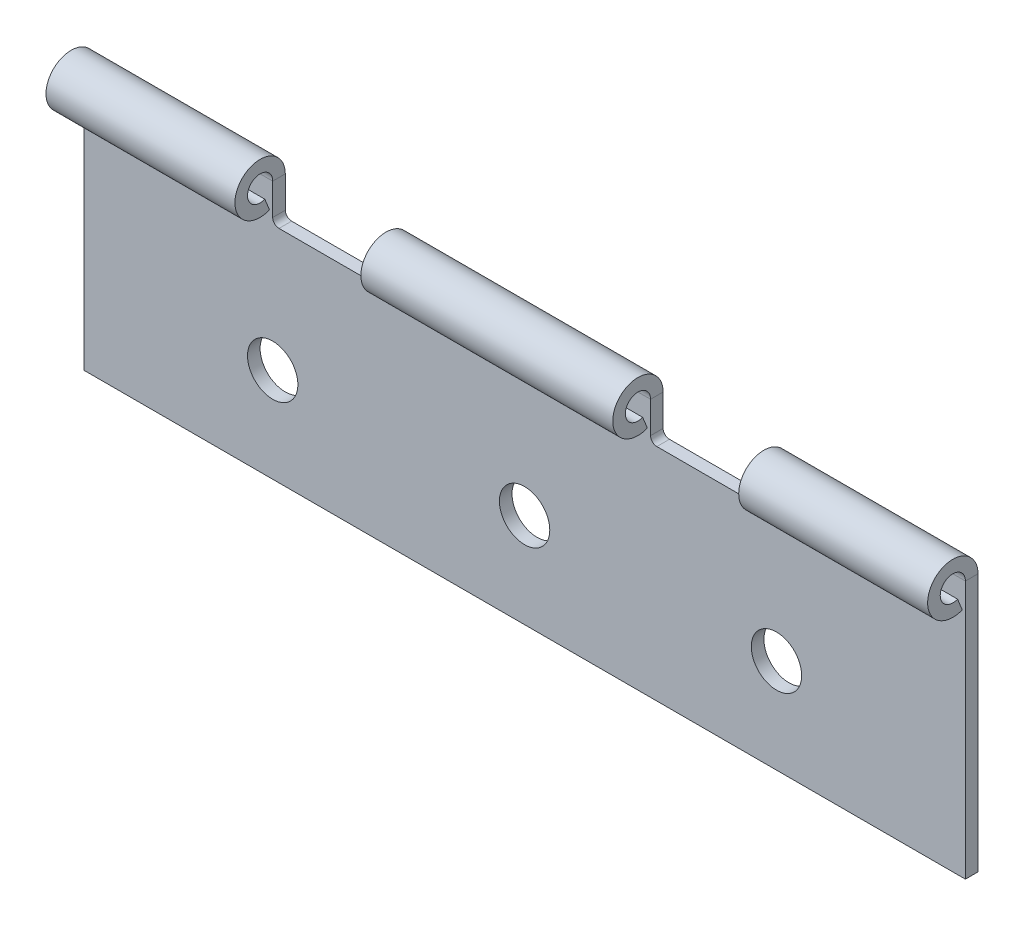
ISO-10303-21;
HEADER;
FILE_DESCRIPTION(('STEP AP214'),'2;1');
FILE_NAME('part.step','',(''),(''),'','','');
FILE_SCHEMA(('AUTOMOTIVE_DESIGN { 1 0 10303 214 1 1 1 1 }'));
ENDSEC;
DATA;
#1=APPLICATION_CONTEXT('core data for automotive mechanical design processes');
#2=APPLICATION_PROTOCOL_DEFINITION('international standard','automotive_design',2000,#1);
#3=PRODUCT_CONTEXT('',#1,'mechanical');
#4=PRODUCT('Part','Part','',(#3));
#5=PRODUCT_RELATED_PRODUCT_CATEGORY('part','',(#4));
#6=PRODUCT_DEFINITION_FORMATION('','',#4);
#7=PRODUCT_DEFINITION_CONTEXT('part definition',#1,'design');
#8=PRODUCT_DEFINITION('design','',#6,#7);
#9=PRODUCT_DEFINITION_SHAPE('','',#8);
#10=(LENGTH_UNIT() NAMED_UNIT(*) SI_UNIT(.MILLI.,.METRE.));
#11=(NAMED_UNIT(*) PLANE_ANGLE_UNIT() SI_UNIT($,.RADIAN.));
#12=(NAMED_UNIT(*) SI_UNIT($,.STERADIAN.) SOLID_ANGLE_UNIT());
#13=UNCERTAINTY_MEASURE_WITH_UNIT(LENGTH_MEASURE(1.E-05),#10,'distance_accuracy_value','');
#14=(GEOMETRIC_REPRESENTATION_CONTEXT(3) GLOBAL_UNCERTAINTY_ASSIGNED_CONTEXT((#13)) GLOBAL_UNIT_ASSIGNED_CONTEXT((#10,
#11,#12)) REPRESENTATION_CONTEXT('',''));
#15=CARTESIAN_POINT('',(0.,0.,0.));
#16=DIRECTION('',(0.,0.,1.));
#17=DIRECTION('',(1.,0.,0.));
#18=AXIS2_PLACEMENT_3D('',#15,#16,#17);
#19=CARTESIAN_POINT('',(110.,40.,-2.));
#20=DIRECTION('',(-1.,0.,0.));
#21=DIRECTION('',(0.,0.,1.));
#22=AXIS2_PLACEMENT_3D('',#19,#20,#21);
#23=PLANE('',#22);
#24=DIRECTION('',(0.,-1.,0.));
#25=VECTOR('',#24,1.);
#26=CARTESIAN_POINT('',(110.,40.,-2.));
#27=LINE('',#26,#25);
#28=CARTESIAN_POINT('',(110.,46.,-2.00000000000001));
#29=VERTEX_POINT('',#28);
#30=CARTESIAN_POINT('',(110.,41.,-2.));
#31=VERTEX_POINT('',#30);
#32=EDGE_CURVE('E209',#29,#31,#27,.T.);
#33=ORIENTED_EDGE('',*,*,#32,.T.);
#34=DIRECTION('',(0.,0.,1.));
#35=VECTOR('',#34,1.);
#36=CARTESIAN_POINT('',(110.,41.,0.));
#37=LINE('',#36,#35);
#38=CARTESIAN_POINT('',(110.,41.,0.));
#39=VERTEX_POINT('',#38);
#40=EDGE_CURVE('E236',#31,#39,#37,.T.);
#41=ORIENTED_EDGE('',*,*,#40,.T.);
#42=DIRECTION('',(0.,-1.,0.));
#43=VECTOR('',#42,1.);
#44=CARTESIAN_POINT('',(110.,40.,0.));
#45=LINE('',#44,#43);
#46=CARTESIAN_POINT('',(110.,46.,0.));
#47=VERTEX_POINT('',#46);
#48=EDGE_CURVE('E238',#47,#39,#45,.T.);
#49=ORIENTED_EDGE('',*,*,#48,.F.);
#50=DIRECTION('',(0.,0.,-1.));
#51=VECTOR('',#50,1.);
#52=CARTESIAN_POINT('',(110.,46.,0.));
#53=LINE('',#52,#51);
#54=EDGE_CURVE('E441',#47,#29,#53,.T.);
#55=ORIENTED_EDGE('',*,*,#54,.T.);
#56=EDGE_LOOP('',(#33,#41,#49,#55));
#57=FACE_BOUND('',#56,.T.);
#58=ADVANCED_FACE('F40',(#57),#23,.T.);
#59=CARTESIAN_POINT('',(50.,40.,-2.));
#60=DIRECTION('',(-1.,0.,0.));
#61=DIRECTION('',(0.,-1.,0.));
#62=AXIS2_PLACEMENT_3D('',#59,#60,#61);
#63=PLANE('',#62);
#64=DIRECTION('',(0.,-1.,0.));
#65=VECTOR('',#64,1.);
#66=CARTESIAN_POINT('',(50.,40.,-2.));
#67=LINE('',#66,#65);
#68=CARTESIAN_POINT('',(50.,46.,-2.));
#69=VERTEX_POINT('',#68);
#70=CARTESIAN_POINT('',(50.,41.,-2.));
#71=VERTEX_POINT('',#70);
#72=EDGE_CURVE('E226',#69,#71,#67,.T.);
#73=ORIENTED_EDGE('',*,*,#72,.T.);
#74=DIRECTION('',(0.,0.,1.));
#75=VECTOR('',#74,1.);
#76=CARTESIAN_POINT('',(50.,41.,0.));
#77=LINE('',#76,#75);
#78=CARTESIAN_POINT('',(50.,41.,0.));
#79=VERTEX_POINT('',#78);
#80=EDGE_CURVE('E263',#71,#79,#77,.T.);
#81=ORIENTED_EDGE('',*,*,#80,.T.);
#82=DIRECTION('',(0.,-1.,0.));
#83=VECTOR('',#82,1.);
#84=CARTESIAN_POINT('',(50.,40.,0.));
#85=LINE('',#84,#83);
#86=CARTESIAN_POINT('',(50.,46.,0.));
#87=VERTEX_POINT('',#86);
#88=EDGE_CURVE('E247',#87,#79,#85,.T.);
#89=ORIENTED_EDGE('',*,*,#88,.F.);
#90=DIRECTION('',(0.,0.,-1.));
#91=VECTOR('',#90,1.);
#92=CARTESIAN_POINT('',(50.,46.,0.));
#93=LINE('',#92,#91);
#94=EDGE_CURVE('E355',#87,#69,#93,.T.);
#95=ORIENTED_EDGE('',*,*,#94,.T.);
#96=EDGE_LOOP('',(#73,#81,#89,#95));
#97=FACE_BOUND('',#96,.T.);
#98=ADVANCED_FACE('F364',(#97),#63,.T.);
#99=CARTESIAN_POINT('',(0.,0.,-2.));
#100=DIRECTION('',(-1.,0.,0.));
#101=DIRECTION('',(0.,0.,1.));
#102=AXIS2_PLACEMENT_3D('',#99,#100,#101);
#103=PLANE('',#102);
#104=DIRECTION('',(0.,-1.,0.));
#105=VECTOR('',#104,1.);
#106=CARTESIAN_POINT('',(0.,0.,-2.));
#107=LINE('',#106,#105);
#108=CARTESIAN_POINT('',(0.,46.,-2.00000000000001));
#109=VERTEX_POINT('',#108);
#110=CARTESIAN_POINT('',(0.,5.,-2.00000000000001));
#111=VERTEX_POINT('',#110);
#112=EDGE_CURVE('E234',#109,#111,#107,.T.);
#113=ORIENTED_EDGE('',*,*,#112,.T.);
#114=DIRECTION('',(0.,0.,1.));
#115=VECTOR('',#114,1.);
#116=CARTESIAN_POINT('',(0.,5.,-2.));
#117=LINE('',#116,#115);
#118=CARTESIAN_POINT('',(0.,5.,0.));
#119=VERTEX_POINT('',#118);
#120=EDGE_CURVE('E11',#111,#119,#117,.T.);
#121=ORIENTED_EDGE('',*,*,#120,.T.);
#122=DIRECTION('',(0.,-1.,0.));
#123=VECTOR('',#122,1.);
#124=CARTESIAN_POINT('',(0.,0.,0.));
#125=LINE('',#124,#123);
#126=CARTESIAN_POINT('',(0.,46.,0.));
#127=VERTEX_POINT('',#126);
#128=EDGE_CURVE('E210',#127,#119,#125,.T.);
#129=ORIENTED_EDGE('',*,*,#128,.F.);
#130=DIRECTION('',(0.,0.,-1.));
#131=VECTOR('',#130,1.);
#132=CARTESIAN_POINT('',(0.,46.,0.));
#133=LINE('',#132,#131);
#134=EDGE_CURVE('E219',#127,#109,#133,.T.);
#135=ORIENTED_EDGE('',*,*,#134,.T.);
#136=EDGE_LOOP('',(#113,#121,#129,#135));
#137=FACE_BOUND('',#136,.T.);
#138=ADVANCED_FACE('F362',(#137),#103,.T.);
#139=CARTESIAN_POINT('',(30.,50.,-2.));
#140=DIRECTION('',(1.,0.,0.));
#141=DIRECTION('',(0.,1.,0.));
#142=AXIS2_PLACEMENT_3D('',#139,#140,#141);
#143=PLANE('',#142);
#144=DIRECTION('',(0.,1.,0.));
#145=VECTOR('',#144,1.);
#146=CARTESIAN_POINT('',(30.,50.,0.));
#147=LINE('',#146,#145);
#148=CARTESIAN_POINT('',(30.,41.,0.));
#149=VERTEX_POINT('',#148);
#150=CARTESIAN_POINT('',(30.,46.,0.));
#151=VERTEX_POINT('',#150);
#152=EDGE_CURVE('E216',#149,#151,#147,.T.);
#153=ORIENTED_EDGE('',*,*,#152,.F.);
#154=DIRECTION('',(0.,0.,1.));
#155=VECTOR('',#154,1.);
#156=CARTESIAN_POINT('',(30.,41.,-2.));
#157=LINE('',#156,#155);
#158=CARTESIAN_POINT('',(30.,41.,-2.));
#159=VERTEX_POINT('',#158);
#160=EDGE_CURVE('E62',#149,#159,#157,.F.);
#161=ORIENTED_EDGE('',*,*,#160,.T.);
#162=DIRECTION('',(0.,1.,0.));
#163=VECTOR('',#162,1.);
#164=CARTESIAN_POINT('',(30.,50.,-2.));
#165=LINE('',#164,#163);
#166=CARTESIAN_POINT('',(30.,46.,-2.));
#167=VERTEX_POINT('',#166);
#168=EDGE_CURVE('E232',#159,#167,#165,.T.);
#169=ORIENTED_EDGE('',*,*,#168,.T.);
#170=DIRECTION('',(0.,0.,-1.));
#171=VECTOR('',#170,1.);
#172=CARTESIAN_POINT('',(30.,46.,0.));
#173=LINE('',#172,#171);
#174=EDGE_CURVE('E303',#151,#167,#173,.T.);
#175=ORIENTED_EDGE('',*,*,#174,.F.);
#176=EDGE_LOOP('',(#153,#161,#169,#175));
#177=FACE_BOUND('',#176,.T.);
#178=ADVANCED_FACE('F301',(#177),#143,.T.);
#179=CARTESIAN_POINT('',(30.,40.,-2.));
#180=DIRECTION('',(0.,1.,0.));
#181=DIRECTION('',(0.,0.,1.));
#182=AXIS2_PLACEMENT_3D('',#179,#180,#181);
#183=PLANE('',#182);
#184=DIRECTION('',(-1.,0.,0.));
#185=VECTOR('',#184,1.);
#186=CARTESIAN_POINT('',(30.,40.,0.));
#187=LINE('',#186,#185);
#188=CARTESIAN_POINT('',(49.,40.,0.));
#189=VERTEX_POINT('',#188);
#190=CARTESIAN_POINT('',(31.,40.,0.));
#191=VERTEX_POINT('',#190);
#192=EDGE_CURVE('E250',#189,#191,#187,.T.);
#193=ORIENTED_EDGE('',*,*,#192,.F.);
#194=DIRECTION('',(0.,0.,1.));
#195=VECTOR('',#194,1.);
#196=CARTESIAN_POINT('',(49.,40.,-2.));
#197=LINE('',#196,#195);
#198=CARTESIAN_POINT('',(49.,40.,-2.));
#199=VERTEX_POINT('',#198);
#200=EDGE_CURVE('E269',#189,#199,#197,.F.);
#201=ORIENTED_EDGE('',*,*,#200,.T.);
#202=DIRECTION('',(-1.,0.,0.));
#203=VECTOR('',#202,1.);
#204=CARTESIAN_POINT('',(30.,40.,-2.));
#205=LINE('',#204,#203);
#206=CARTESIAN_POINT('',(31.,40.,-2.));
#207=VERTEX_POINT('',#206);
#208=EDGE_CURVE('E229',#199,#207,#205,.T.);
#209=ORIENTED_EDGE('',*,*,#208,.T.);
#210=DIRECTION('',(0.,0.,1.));
#211=VECTOR('',#210,1.);
#212=CARTESIAN_POINT('',(31.,40.,0.));
#213=LINE('',#212,#211);
#214=EDGE_CURVE('E266',#207,#191,#213,.T.);
#215=ORIENTED_EDGE('',*,*,#214,.T.);
#216=EDGE_LOOP('',(#193,#201,#209,#215));
#217=FACE_BOUND('',#216,.T.);
#218=ADVANCED_FACE('F294',(#217),#183,.T.);
#219=CARTESIAN_POINT('',(90.,50.,-2.));
#220=DIRECTION('',(1.,0.,0.));
#221=DIRECTION('',(0.,1.,0.));
#222=AXIS2_PLACEMENT_3D('',#219,#220,#221);
#223=PLANE('',#222);
#224=DIRECTION('',(0.,1.,0.));
#225=VECTOR('',#224,1.);
#226=CARTESIAN_POINT('',(90.,50.,0.));
#227=LINE('',#226,#225);
#228=CARTESIAN_POINT('',(90.,41.,0.));
#229=VERTEX_POINT('',#228);
#230=CARTESIAN_POINT('',(90.,46.,0.));
#231=VERTEX_POINT('',#230);
#232=EDGE_CURVE('E245',#229,#231,#227,.T.);
#233=ORIENTED_EDGE('',*,*,#232,.F.);
#234=DIRECTION('',(0.,0.,1.));
#235=VECTOR('',#234,1.);
#236=CARTESIAN_POINT('',(90.,41.,-2.));
#237=LINE('',#236,#235);
#238=CARTESIAN_POINT('',(90.,41.,-2.));
#239=VERTEX_POINT('',#238);
#240=EDGE_CURVE('E261',#229,#239,#237,.F.);
#241=ORIENTED_EDGE('',*,*,#240,.T.);
#242=DIRECTION('',(0.,1.,0.));
#243=VECTOR('',#242,1.);
#244=CARTESIAN_POINT('',(90.,50.,-2.));
#245=LINE('',#244,#243);
#246=CARTESIAN_POINT('',(90.,46.,-2.));
#247=VERTEX_POINT('',#246);
#248=EDGE_CURVE('E224',#239,#247,#245,.T.);
#249=ORIENTED_EDGE('',*,*,#248,.T.);
#250=DIRECTION('',(0.,0.,-1.));
#251=VECTOR('',#250,1.);
#252=CARTESIAN_POINT('',(90.,46.,0.));
#253=LINE('',#252,#251);
#254=EDGE_CURVE('E351',#231,#247,#253,.T.);
#255=ORIENTED_EDGE('',*,*,#254,.F.);
#256=EDGE_LOOP('',(#233,#241,#249,#255));
#257=FACE_BOUND('',#256,.T.);
#258=ADVANCED_FACE('F550',(#257),#223,.T.);
#259=CARTESIAN_POINT('',(90.,40.,-2.));
#260=DIRECTION('',(0.,1.,0.));
#261=DIRECTION('',(0.,0.,1.));
#262=AXIS2_PLACEMENT_3D('',#259,#260,#261);
#263=PLANE('',#262);
#264=DIRECTION('',(-1.,0.,0.));
#265=VECTOR('',#264,1.);
#266=CARTESIAN_POINT('',(90.,40.,0.));
#267=LINE('',#266,#265);
#268=CARTESIAN_POINT('',(109.,40.,0.));
#269=VERTEX_POINT('',#268);
#270=CARTESIAN_POINT('',(91.,40.,0.));
#271=VERTEX_POINT('',#270);
#272=EDGE_CURVE('E242',#269,#271,#267,.T.);
#273=ORIENTED_EDGE('',*,*,#272,.F.);
#274=DIRECTION('',(0.,0.,1.));
#275=VECTOR('',#274,1.);
#276=CARTESIAN_POINT('',(109.,40.,-2.));
#277=LINE('',#276,#275);
#278=CARTESIAN_POINT('',(109.,40.,-2.));
#279=VERTEX_POINT('',#278);
#280=EDGE_CURVE('E259',#269,#279,#277,.F.);
#281=ORIENTED_EDGE('',*,*,#280,.T.);
#282=DIRECTION('',(-1.,0.,0.));
#283=VECTOR('',#282,1.);
#284=CARTESIAN_POINT('',(90.,40.,-2.));
#285=LINE('',#284,#283);
#286=CARTESIAN_POINT('',(91.,40.,-2.));
#287=VERTEX_POINT('',#286);
#288=EDGE_CURVE('E213',#279,#287,#285,.T.);
#289=ORIENTED_EDGE('',*,*,#288,.T.);
#290=DIRECTION('',(0.,0.,1.));
#291=VECTOR('',#290,1.);
#292=CARTESIAN_POINT('',(91.,40.,0.));
#293=LINE('',#292,#291);
#294=EDGE_CURVE('E256',#287,#271,#293,.T.);
#295=ORIENTED_EDGE('',*,*,#294,.T.);
#296=EDGE_LOOP('',(#273,#281,#289,#295));
#297=FACE_BOUND('',#296,.T.);
#298=ADVANCED_FACE('F381',(#297),#263,.T.);
#299=CARTESIAN_POINT('',(140.,50.,-2.));
#300=DIRECTION('',(1.,0.,0.));
#301=DIRECTION('',(0.,0.,-1.));
#302=AXIS2_PLACEMENT_3D('',#299,#300,#301);
#303=PLANE('',#302);
#304=DIRECTION('',(0.,1.,0.));
#305=VECTOR('',#304,1.);
#306=CARTESIAN_POINT('',(140.,50.,0.));
#307=LINE('',#306,#305);
#308=CARTESIAN_POINT('',(140.,5.,0.));
#309=VERTEX_POINT('',#308);
#310=CARTESIAN_POINT('',(140.,46.,0.));
#311=VERTEX_POINT('',#310);
#312=EDGE_CURVE('E202',#309,#311,#307,.T.);
#313=ORIENTED_EDGE('',*,*,#312,.F.);
#314=DIRECTION('',(0.,0.,1.));
#315=VECTOR('',#314,1.);
#316=CARTESIAN_POINT('',(140.,5.,-2.));
#317=LINE('',#316,#315);
#318=CARTESIAN_POINT('',(140.,5.,-2.00000000000001));
#319=VERTEX_POINT('',#318);
#320=EDGE_CURVE('E48',#309,#319,#317,.F.);
#321=ORIENTED_EDGE('',*,*,#320,.T.);
#322=DIRECTION('',(0.,1.,0.));
#323=VECTOR('',#322,1.);
#324=CARTESIAN_POINT('',(140.,50.,-2.));
#325=LINE('',#324,#323);
#326=CARTESIAN_POINT('',(140.,46.,-2.));
#327=VERTEX_POINT('',#326);
#328=EDGE_CURVE('E200',#319,#327,#325,.T.);
#329=ORIENTED_EDGE('',*,*,#328,.T.);
#330=DIRECTION('',(0.,0.,-1.));
#331=VECTOR('',#330,1.);
#332=CARTESIAN_POINT('',(140.,46.,0.));
#333=LINE('',#332,#331);
#334=EDGE_CURVE('E522',#311,#327,#333,.T.);
#335=ORIENTED_EDGE('',*,*,#334,.F.);
#336=EDGE_LOOP('',(#313,#321,#329,#335));
#337=FACE_BOUND('',#336,.T.);
#338=ADVANCED_FACE('F198',(#337),#303,.T.);
#339=CARTESIAN_POINT('',(0.,0.,-2.));
#340=DIRECTION('',(0.,0.,-1.));
#341=DIRECTION('',(-1.,0.,0.));
#342=AXIS2_PLACEMENT_3D('',#339,#340,#341);
#343=PLANE('',#342);
#344=DIRECTION('',(-1.,0.,0.));
#345=VECTOR('',#344,1.);
#346=CARTESIAN_POINT('',(0.,5.,-2.00000000000001));
#347=LINE('',#346,#345);
#348=EDGE_CURVE('E187',#319,#111,#347,.T.);
#349=ORIENTED_EDGE('',*,*,#348,.T.);
#350=ORIENTED_EDGE('',*,*,#112,.F.);
#351=DIRECTION('',(-1.,0.,0.));
#352=VECTOR('',#351,1.);
#353=CARTESIAN_POINT('',(0.,46.,-2.00000000000001));
#354=LINE('',#353,#352);
#355=EDGE_CURVE('E332',#109,#167,#354,.F.);
#356=ORIENTED_EDGE('',*,*,#355,.T.);
#357=ORIENTED_EDGE('',*,*,#168,.F.);
#358=CARTESIAN_POINT('',(31.,41.,-2.));
#359=DIRECTION('',(0.,0.,-1.));
#360=DIRECTION('',(-1.,0.,0.));
#361=AXIS2_PLACEMENT_3D('',#358,#359,#360);
#362=CIRCLE('',#361,1.);
#363=EDGE_CURVE('E203',#159,#207,#362,.F.);
#364=ORIENTED_EDGE('',*,*,#363,.T.);
#365=ORIENTED_EDGE('',*,*,#208,.F.);
#366=CARTESIAN_POINT('',(49.,41.,-2.));
#367=DIRECTION('',(0.,0.,-1.));
#368=DIRECTION('',(-1.,0.,0.));
#369=AXIS2_PLACEMENT_3D('',#366,#367,#368);
#370=CIRCLE('',#369,1.);
#371=EDGE_CURVE('E282',#199,#71,#370,.F.);
#372=ORIENTED_EDGE('',*,*,#371,.T.);
#373=ORIENTED_EDGE('',*,*,#72,.F.);
#374=DIRECTION('',(-1.,0.,0.));
#375=VECTOR('',#374,1.);
#376=CARTESIAN_POINT('',(50.,46.,-2.));
#377=LINE('',#376,#375);
#378=EDGE_CURVE('E434',#69,#247,#377,.F.);
#379=ORIENTED_EDGE('',*,*,#378,.T.);
#380=ORIENTED_EDGE('',*,*,#248,.F.);
#381=CARTESIAN_POINT('',(91.,41.,-2.));
#382=DIRECTION('',(0.,0.,-1.));
#383=DIRECTION('',(-1.,0.,0.));
#384=AXIS2_PLACEMENT_3D('',#381,#382,#383);
#385=CIRCLE('',#384,1.);
#386=EDGE_CURVE('E278',#239,#287,#385,.F.);
#387=ORIENTED_EDGE('',*,*,#386,.T.);
#388=ORIENTED_EDGE('',*,*,#288,.F.);
#389=CARTESIAN_POINT('',(109.,41.,-2.));
#390=DIRECTION('',(0.,0.,-1.));
#391=DIRECTION('',(-1.,0.,0.));
#392=AXIS2_PLACEMENT_3D('',#389,#390,#391);
#393=CIRCLE('',#392,1.);
#394=EDGE_CURVE('E274',#279,#31,#393,.F.);
#395=ORIENTED_EDGE('',*,*,#394,.T.);
#396=ORIENTED_EDGE('',*,*,#32,.F.);
#397=DIRECTION('',(-1.,0.,0.));
#398=VECTOR('',#397,1.);
#399=CARTESIAN_POINT('',(110.,46.,-2.00000000000001));
#400=LINE('',#399,#398);
#401=EDGE_CURVE('E208',#29,#327,#400,.F.);
#402=ORIENTED_EDGE('',*,*,#401,.T.);
#403=ORIENTED_EDGE('',*,*,#328,.F.);
#404=EDGE_LOOP('',(#349,#350,#356,#357,#364,#365,#372,#373,#379,#380,#387,#388,#395,#396,#402,#403));
#405=FACE_BOUND('',#404,.T.);
#406=CARTESIAN_POINT('',(110.,20.,-2.));
#407=DIRECTION('',(0.,0.,-1.));
#408=DIRECTION('',(-1.,0.,0.));
#409=AXIS2_PLACEMENT_3D('',#406,#407,#408);
#410=CIRCLE('',#409,4.00000000000001);
#411=CARTESIAN_POINT('',(106.,20.,-2.));
#412=VERTEX_POINT('',#411);
#413=EDGE_CURVE('E847',#412,#412,#410,.T.);
#414=ORIENTED_EDGE('',*,*,#413,.F.);
#415=EDGE_LOOP('',(#414));
#416=FACE_BOUND('',#415,.T.);
#417=CARTESIAN_POINT('',(30.,20.,-2.));
#418=DIRECTION('',(0.,0.,-1.));
#419=DIRECTION('',(-1.,0.,0.));
#420=AXIS2_PLACEMENT_3D('',#417,#418,#419);
#421=CIRCLE('',#420,4.);
#422=CARTESIAN_POINT('',(26.,20.,-2.));
#423=VERTEX_POINT('',#422);
#424=EDGE_CURVE('E494',#423,#423,#421,.T.);
#425=ORIENTED_EDGE('',*,*,#424,.F.);
#426=EDGE_LOOP('',(#425));
#427=FACE_BOUND('',#426,.T.);
#428=CARTESIAN_POINT('',(70.,20.,-2.00000000000001));
#429=DIRECTION('',(0.,0.,1.));
#430=DIRECTION('',(1.,0.,0.));
#431=AXIS2_PLACEMENT_3D('',#428,#429,#430);
#432=CIRCLE('',#431,4.00000000000001);
#433=CARTESIAN_POINT('',(74.,20.,-2.00000000000001));
#434=VERTEX_POINT('',#433);
#435=EDGE_CURVE('E493',#434,#434,#432,.T.);
#436=ORIENTED_EDGE('',*,*,#435,.T.);
#437=EDGE_LOOP('',(#436));
#438=FACE_BOUND('',#437,.T.);
#439=ADVANCED_FACE('F205',(#405,#416,#427,#438),#343,.T.);
#440=CARTESIAN_POINT('',(0.,0.,0.));
#441=DIRECTION('',(0.,0.,-1.));
#442=DIRECTION('',(-1.,0.,0.));
#443=AXIS2_PLACEMENT_3D('',#440,#441,#442);
#444=PLANE('',#443);
#445=CARTESIAN_POINT('',(110.,20.,0.));
#446=DIRECTION('',(0.,0.,1.));
#447=DIRECTION('',(1.,0.,0.));
#448=AXIS2_PLACEMENT_3D('',#445,#446,#447);
#449=CIRCLE('',#448,4.00000000000001);
#450=CARTESIAN_POINT('',(114.,20.,0.));
#451=VERTEX_POINT('',#450);
#452=EDGE_CURVE('E194',#451,#451,#449,.T.);
#453=ORIENTED_EDGE('',*,*,#452,.F.);
#454=EDGE_LOOP('',(#453));
#455=FACE_BOUND('',#454,.T.);
#456=CARTESIAN_POINT('',(30.,20.,0.));
#457=DIRECTION('',(0.,0.,1.));
#458=DIRECTION('',(1.,0.,0.));
#459=AXIS2_PLACEMENT_3D('',#456,#457,#458);
#460=CIRCLE('',#459,4.);
#461=CARTESIAN_POINT('',(34.,20.,0.));
#462=VERTEX_POINT('',#461);
#463=EDGE_CURVE('E488',#462,#462,#460,.T.);
#464=ORIENTED_EDGE('',*,*,#463,.F.);
#465=EDGE_LOOP('',(#464));
#466=FACE_BOUND('',#465,.T.);
#467=CARTESIAN_POINT('',(70.,20.,0.));
#468=DIRECTION('',(0.,0.,1.));
#469=DIRECTION('',(1.,0.,0.));
#470=AXIS2_PLACEMENT_3D('',#467,#468,#469);
#471=CIRCLE('',#470,4.00000000000001);
#472=CARTESIAN_POINT('',(74.,20.,0.));
#473=VERTEX_POINT('',#472);
#474=EDGE_CURVE('E491',#473,#473,#471,.T.);
#475=ORIENTED_EDGE('',*,*,#474,.F.);
#476=EDGE_LOOP('',(#475));
#477=FACE_BOUND('',#476,.T.);
#478=ORIENTED_EDGE('',*,*,#128,.T.);
#479=DIRECTION('',(-1.,0.,0.));
#480=VECTOR('',#479,1.);
#481=CARTESIAN_POINT('',(0.,5.,0.));
#482=LINE('',#481,#480);
#483=EDGE_CURVE('E55',#309,#119,#482,.T.);
#484=ORIENTED_EDGE('',*,*,#483,.F.);
#485=ORIENTED_EDGE('',*,*,#312,.T.);
#486=DIRECTION('',(-1.,0.,0.));
#487=VECTOR('',#486,1.);
#488=CARTESIAN_POINT('',(110.,46.,0.));
#489=LINE('',#488,#487);
#490=EDGE_CURVE('E515',#47,#311,#489,.F.);
#491=ORIENTED_EDGE('',*,*,#490,.F.);
#492=ORIENTED_EDGE('',*,*,#48,.T.);
#493=CARTESIAN_POINT('',(109.,41.,0.));
#494=DIRECTION('',(0.,0.,-1.));
#495=DIRECTION('',(-1.,0.,0.));
#496=AXIS2_PLACEMENT_3D('',#493,#494,#495);
#497=CIRCLE('',#496,1.);
#498=EDGE_CURVE('E272',#39,#269,#497,.T.);
#499=ORIENTED_EDGE('',*,*,#498,.T.);
#500=ORIENTED_EDGE('',*,*,#272,.T.);
#501=CARTESIAN_POINT('',(91.,41.,0.));
#502=DIRECTION('',(0.,0.,-1.));
#503=DIRECTION('',(-1.,0.,0.));
#504=AXIS2_PLACEMENT_3D('',#501,#502,#503);
#505=CIRCLE('',#504,1.);
#506=EDGE_CURVE('E276',#271,#229,#505,.T.);
#507=ORIENTED_EDGE('',*,*,#506,.T.);
#508=ORIENTED_EDGE('',*,*,#232,.T.);
#509=DIRECTION('',(-1.,0.,0.));
#510=VECTOR('',#509,1.);
#511=CARTESIAN_POINT('',(50.,46.,0.));
#512=LINE('',#511,#510);
#513=EDGE_CURVE('E409',#87,#231,#512,.F.);
#514=ORIENTED_EDGE('',*,*,#513,.F.);
#515=ORIENTED_EDGE('',*,*,#88,.T.);
#516=CARTESIAN_POINT('',(49.,41.,0.));
#517=DIRECTION('',(0.,0.,-1.));
#518=DIRECTION('',(-1.,0.,0.));
#519=AXIS2_PLACEMENT_3D('',#516,#517,#518);
#520=CIRCLE('',#519,1.);
#521=EDGE_CURVE('E280',#79,#189,#520,.T.);
#522=ORIENTED_EDGE('',*,*,#521,.T.);
#523=ORIENTED_EDGE('',*,*,#192,.T.);
#524=CARTESIAN_POINT('',(31.,41.,0.));
#525=DIRECTION('',(0.,0.,-1.));
#526=DIRECTION('',(-1.,0.,0.));
#527=AXIS2_PLACEMENT_3D('',#524,#525,#526);
#528=CIRCLE('',#527,1.);
#529=EDGE_CURVE('E284',#191,#149,#528,.T.);
#530=ORIENTED_EDGE('',*,*,#529,.T.);
#531=ORIENTED_EDGE('',*,*,#152,.T.);
#532=DIRECTION('',(-1.,0.,0.));
#533=VECTOR('',#532,1.);
#534=CARTESIAN_POINT('',(0.,46.,0.));
#535=LINE('',#534,#533);
#536=EDGE_CURVE('E338',#127,#151,#535,.F.);
#537=ORIENTED_EDGE('',*,*,#536,.F.);
#538=EDGE_LOOP('',(#478,#484,#485,#491,#492,#499,#500,#507,#508,#514,#515,#522,#523,#530,#531,#537));
#539=FACE_BOUND('',#538,.T.);
#540=ADVANCED_FACE('F297',(#455,#466,#477,#539),#444,.F.);
#541=CARTESIAN_POINT('',(15.,44.1456322908664,1.25078681316815));
#542=DIRECTION('',(0.,-0.374606593415923,0.927183854566783));
#543=DIRECTION('',(-1.,0.,0.));
#544=AXIS2_PLACEMENT_3D('',#541,#542,#543);
#545=PLANE('',#544);
#546=DIRECTION('',(0.,-0.927183854566783,-0.374606593415923));
#547=VECTOR('',#546,1.);
#548=CARTESIAN_POINT('',(0.,44.1456322908664,1.25078681316815));
#549=LINE('',#548,#547);
#550=CARTESIAN_POINT('',(0.,44.1456322908664,1.25078681316815));
#551=VERTEX_POINT('',#550);
#552=CARTESIAN_POINT('',(0.,42.2912645817329,0.501573626336305));
#553=VERTEX_POINT('',#552);
#554=EDGE_CURVE('E239',#551,#553,#549,.T.);
#555=ORIENTED_EDGE('',*,*,#554,.F.);
#556=DIRECTION('',(-1.,0.,0.));
#557=VECTOR('',#556,1.);
#558=CARTESIAN_POINT('',(0.,44.1456322908664,1.25078681316815));
#559=LINE('',#558,#557);
#560=CARTESIAN_POINT('',(30.,44.1456322908664,1.25078681316815));
#561=VERTEX_POINT('',#560);
#562=EDGE_CURVE('E314',#561,#551,#559,.T.);
#563=ORIENTED_EDGE('',*,*,#562,.F.);
#564=DIRECTION('',(0.,-0.927183854566783,-0.374606593415923));
#565=VECTOR('',#564,1.);
#566=CARTESIAN_POINT('',(30.,44.1456322908664,1.25078681316815));
#567=LINE('',#566,#565);
#568=CARTESIAN_POINT('',(30.,42.2912645817329,0.501573626336308));
#569=VERTEX_POINT('',#568);
#570=EDGE_CURVE('E308',#561,#569,#567,.T.);
#571=ORIENTED_EDGE('',*,*,#570,.T.);
#572=DIRECTION('',(-1.,0.,0.));
#573=VECTOR('',#572,1.);
#574=CARTESIAN_POINT('',(0.,42.2912645817329,0.501573626336305));
#575=LINE('',#574,#573);
#576=EDGE_CURVE('E331',#569,#553,#575,.T.);
#577=ORIENTED_EDGE('',*,*,#576,.T.);
#578=EDGE_LOOP('',(#555,#563,#571,#577));
#579=FACE_BOUND('',#578,.T.);
#580=ADVANCED_FACE('F334',(#579),#545,.F.);
#581=CARTESIAN_POINT('',(30.,46.,2.));
#582=DIRECTION('',(1.,0.,0.));
#583=DIRECTION('',(0.,0.,-1.));
#584=AXIS2_PLACEMENT_3D('',#581,#582,#583);
#585=PLANE('',#584);
#586=ORIENTED_EDGE('',*,*,#570,.F.);
#587=CARTESIAN_POINT('',(30.,46.,2.));
#588=DIRECTION('',(-1.,0.,0.));
#589=DIRECTION('',(0.,0.,1.));
#590=AXIS2_PLACEMENT_3D('',#587,#588,#589);
#591=CIRCLE('',#590,2.);
#592=EDGE_CURVE('E335',#151,#561,#591,.F.);
#593=ORIENTED_EDGE('',*,*,#592,.F.);
#594=ORIENTED_EDGE('',*,*,#174,.T.);
#595=CARTESIAN_POINT('',(30.,46.,2.));
#596=DIRECTION('',(-1.,0.,0.));
#597=DIRECTION('',(0.,0.,1.));
#598=AXIS2_PLACEMENT_3D('',#595,#596,#597);
#599=CIRCLE('',#598,4.);
#600=EDGE_CURVE('E312',#167,#569,#599,.F.);
#601=ORIENTED_EDGE('',*,*,#600,.T.);
#602=EDGE_LOOP('',(#586,#593,#594,#601));
#603=FACE_BOUND('',#602,.T.);
#604=ADVANCED_FACE('F358',(#603),#585,.T.);
#605=CARTESIAN_POINT('',(0.,46.,2.));
#606=DIRECTION('',(1.,0.,0.));
#607=DIRECTION('',(0.,0.,-1.));
#608=AXIS2_PLACEMENT_3D('',#605,#606,#607);
#609=PLANE('',#608);
#610=CARTESIAN_POINT('',(0.,46.,2.));
#611=DIRECTION('',(-1.,0.,0.));
#612=DIRECTION('',(0.,0.,1.));
#613=AXIS2_PLACEMENT_3D('',#610,#611,#612);
#614=CIRCLE('',#613,2.);
#615=EDGE_CURVE('E323',#551,#127,#614,.T.);
#616=ORIENTED_EDGE('',*,*,#615,.F.);
#617=ORIENTED_EDGE('',*,*,#554,.T.);
#618=CARTESIAN_POINT('',(0.,46.,2.));
#619=DIRECTION('',(-1.,0.,0.));
#620=DIRECTION('',(0.,0.,1.));
#621=AXIS2_PLACEMENT_3D('',#618,#619,#620);
#622=CIRCLE('',#621,4.);
#623=EDGE_CURVE('E322',#553,#109,#622,.T.);
#624=ORIENTED_EDGE('',*,*,#623,.T.);
#625=ORIENTED_EDGE('',*,*,#134,.F.);
#626=EDGE_LOOP('',(#616,#617,#624,#625));
#627=FACE_BOUND('',#626,.T.);
#628=ADVANCED_FACE('F320',(#627),#609,.F.);
#629=CARTESIAN_POINT('',(0.,46.,2.));
#630=DIRECTION('',(-1.,0.,0.));
#631=DIRECTION('',(0.,-0.927183854566783,-0.374606593415923));
#632=AXIS2_PLACEMENT_3D('',#629,#630,#631);
#633=CYLINDRICAL_SURFACE('',#632,4.);
#634=ORIENTED_EDGE('',*,*,#355,.F.);
#635=ORIENTED_EDGE('',*,*,#623,.F.);
#636=ORIENTED_EDGE('',*,*,#576,.F.);
#637=ORIENTED_EDGE('',*,*,#600,.F.);
#638=EDGE_LOOP('',(#634,#635,#636,#637));
#639=FACE_BOUND('',#638,.T.);
#640=ADVANCED_FACE('F330',(#639),#633,.T.);
#641=CARTESIAN_POINT('',(0.,46.,2.));
#642=DIRECTION('',(-1.,0.,0.));
#643=DIRECTION('',(0.,-0.927183854566783,-0.374606593415923));
#644=AXIS2_PLACEMENT_3D('',#641,#642,#643);
#645=CYLINDRICAL_SURFACE('',#644,2.);
#646=ORIENTED_EDGE('',*,*,#536,.T.);
#647=ORIENTED_EDGE('',*,*,#592,.T.);
#648=ORIENTED_EDGE('',*,*,#562,.T.);
#649=ORIENTED_EDGE('',*,*,#615,.T.);
#650=EDGE_LOOP('',(#646,#647,#648,#649));
#651=FACE_BOUND('',#650,.T.);
#652=ADVANCED_FACE('F359',(#651),#645,.F.);
#653=CARTESIAN_POINT('',(70.,44.1456322908664,1.25078681316815));
#654=DIRECTION('',(0.,-0.374606593415923,0.927183854566783));
#655=DIRECTION('',(-1.,0.,0.));
#656=AXIS2_PLACEMENT_3D('',#653,#654,#655);
#657=PLANE('',#656);
#658=DIRECTION('',(0.,-0.927183854566783,-0.374606593415923));
#659=VECTOR('',#658,1.);
#660=CARTESIAN_POINT('',(50.,44.1456322908664,1.25078681316815));
#661=LINE('',#660,#659);
#662=CARTESIAN_POINT('',(50.,44.1456322908664,1.25078681316815));
#663=VERTEX_POINT('',#662);
#664=CARTESIAN_POINT('',(50.,42.2912645817329,0.501573626336307));
#665=VERTEX_POINT('',#664);
#666=EDGE_CURVE('E344',#663,#665,#661,.T.);
#667=ORIENTED_EDGE('',*,*,#666,.F.);
#668=DIRECTION('',(-1.,0.,0.));
#669=VECTOR('',#668,1.);
#670=CARTESIAN_POINT('',(50.,44.1456322908664,1.25078681316815));
#671=LINE('',#670,#669);
#672=CARTESIAN_POINT('',(90.,44.1456322908664,1.25078681316815));
#673=VERTEX_POINT('',#672);
#674=EDGE_CURVE('E418',#673,#663,#671,.T.);
#675=ORIENTED_EDGE('',*,*,#674,.F.);
#676=DIRECTION('',(0.,-0.927183854566783,-0.374606593415923));
#677=VECTOR('',#676,1.);
#678=CARTESIAN_POINT('',(90.,44.1456322908664,1.25078681316815));
#679=LINE('',#678,#677);
#680=CARTESIAN_POINT('',(90.,42.2912645817329,0.501573626336307));
#681=VERTEX_POINT('',#680);
#682=EDGE_CURVE('E345',#673,#681,#679,.T.);
#683=ORIENTED_EDGE('',*,*,#682,.T.);
#684=DIRECTION('',(-1.,0.,0.));
#685=VECTOR('',#684,1.);
#686=CARTESIAN_POINT('',(50.,42.2912645817329,0.501573626336307));
#687=LINE('',#686,#685);
#688=EDGE_CURVE('E416',#681,#665,#687,.T.);
#689=ORIENTED_EDGE('',*,*,#688,.T.);
#690=EDGE_LOOP('',(#667,#675,#683,#689));
#691=FACE_BOUND('',#690,.T.);
#692=ADVANCED_FACE('F445',(#691),#657,.F.);
#693=CARTESIAN_POINT('',(90.,46.,2.));
#694=DIRECTION('',(1.,0.,0.));
#695=DIRECTION('',(0.,0.,-1.));
#696=AXIS2_PLACEMENT_3D('',#693,#694,#695);
#697=PLANE('',#696);
#698=ORIENTED_EDGE('',*,*,#682,.F.);
#699=CARTESIAN_POINT('',(90.,46.,2.));
#700=DIRECTION('',(-1.,0.,0.));
#701=DIRECTION('',(0.,0.,1.));
#702=AXIS2_PLACEMENT_3D('',#699,#700,#701);
#703=CIRCLE('',#702,1.99999999999999);
#704=EDGE_CURVE('E414',#231,#673,#703,.F.);
#705=ORIENTED_EDGE('',*,*,#704,.F.);
#706=ORIENTED_EDGE('',*,*,#254,.T.);
#707=CARTESIAN_POINT('',(90.,46.,2.));
#708=DIRECTION('',(-1.,0.,0.));
#709=DIRECTION('',(0.,0.,1.));
#710=AXIS2_PLACEMENT_3D('',#707,#708,#709);
#711=CIRCLE('',#710,3.99999999999999);
#712=EDGE_CURVE('E357',#247,#681,#711,.F.);
#713=ORIENTED_EDGE('',*,*,#712,.T.);
#714=EDGE_LOOP('',(#698,#705,#706,#713));
#715=FACE_BOUND('',#714,.T.);
#716=ADVANCED_FACE('F429',(#715),#697,.T.);
#717=CARTESIAN_POINT('',(50.,46.,2.));
#718=DIRECTION('',(1.,0.,0.));
#719=DIRECTION('',(0.,0.,-1.));
#720=AXIS2_PLACEMENT_3D('',#717,#718,#719);
#721=PLANE('',#720);
#722=CARTESIAN_POINT('',(50.,46.,2.));
#723=DIRECTION('',(-1.,0.,0.));
#724=DIRECTION('',(0.,0.,1.));
#725=AXIS2_PLACEMENT_3D('',#722,#723,#724);
#726=CIRCLE('',#725,1.99999999999999);
#727=EDGE_CURVE('E406',#663,#87,#726,.T.);
#728=ORIENTED_EDGE('',*,*,#727,.F.);
#729=ORIENTED_EDGE('',*,*,#666,.T.);
#730=CARTESIAN_POINT('',(50.,46.,2.));
#731=DIRECTION('',(-1.,0.,0.));
#732=DIRECTION('',(0.,0.,1.));
#733=AXIS2_PLACEMENT_3D('',#730,#731,#732);
#734=CIRCLE('',#733,3.99999999999999);
#735=EDGE_CURVE('E407',#665,#69,#734,.T.);
#736=ORIENTED_EDGE('',*,*,#735,.T.);
#737=ORIENTED_EDGE('',*,*,#94,.F.);
#738=EDGE_LOOP('',(#728,#729,#736,#737));
#739=FACE_BOUND('',#738,.T.);
#740=ADVANCED_FACE('F405',(#739),#721,.F.);
#741=CARTESIAN_POINT('',(50.,46.,2.));
#742=DIRECTION('',(-1.,0.,0.));
#743=DIRECTION('',(0.,-0.927183854566783,-0.374606593415923));
#744=AXIS2_PLACEMENT_3D('',#741,#742,#743);
#745=CYLINDRICAL_SURFACE('',#744,3.99999999999999);
#746=ORIENTED_EDGE('',*,*,#378,.F.);
#747=ORIENTED_EDGE('',*,*,#735,.F.);
#748=ORIENTED_EDGE('',*,*,#688,.F.);
#749=ORIENTED_EDGE('',*,*,#712,.F.);
#750=EDGE_LOOP('',(#746,#747,#748,#749));
#751=FACE_BOUND('',#750,.T.);
#752=ADVANCED_FACE('F433',(#751),#745,.T.);
#753=CARTESIAN_POINT('',(50.,46.,2.));
#754=DIRECTION('',(-1.,0.,0.));
#755=DIRECTION('',(0.,-0.927183854566783,-0.374606593415923));
#756=AXIS2_PLACEMENT_3D('',#753,#754,#755);
#757=CYLINDRICAL_SURFACE('',#756,1.99999999999999);
#758=ORIENTED_EDGE('',*,*,#513,.T.);
#759=ORIENTED_EDGE('',*,*,#704,.T.);
#760=ORIENTED_EDGE('',*,*,#674,.T.);
#761=ORIENTED_EDGE('',*,*,#727,.T.);
#762=EDGE_LOOP('',(#758,#759,#760,#761));
#763=FACE_BOUND('',#762,.T.);
#764=ADVANCED_FACE('F447',(#763),#757,.F.);
#765=CARTESIAN_POINT('',(125.,44.1456322908664,1.25078681316815));
#766=DIRECTION('',(0.,-0.374606593415923,0.927183854566783));
#767=DIRECTION('',(-1.,0.,0.));
#768=AXIS2_PLACEMENT_3D('',#765,#766,#767);
#769=PLANE('',#768);
#770=DIRECTION('',(0.,-0.927183854566783,-0.374606593415923));
#771=VECTOR('',#770,1.);
#772=CARTESIAN_POINT('',(110.,44.1456322908664,1.25078681316815));
#773=LINE('',#772,#771);
#774=CARTESIAN_POINT('',(110.,44.1456322908664,1.25078681316815));
#775=VERTEX_POINT('',#774);
#776=CARTESIAN_POINT('',(110.,42.2912645817329,0.501573626336305));
#777=VERTEX_POINT('',#776);
#778=EDGE_CURVE('E423',#775,#777,#773,.T.);
#779=ORIENTED_EDGE('',*,*,#778,.F.);
#780=DIRECTION('',(-1.,0.,0.));
#781=VECTOR('',#780,1.);
#782=CARTESIAN_POINT('',(110.,44.1456322908664,1.25078681316815));
#783=LINE('',#782,#781);
#784=CARTESIAN_POINT('',(140.,44.1456322908664,1.25078681316815));
#785=VERTEX_POINT('',#784);
#786=EDGE_CURVE('E497',#785,#775,#783,.T.);
#787=ORIENTED_EDGE('',*,*,#786,.F.);
#788=DIRECTION('',(0.,-0.927183854566783,-0.374606593415923));
#789=VECTOR('',#788,1.);
#790=CARTESIAN_POINT('',(140.,44.1456322908664,1.25078681316815));
#791=LINE('',#790,#789);
#792=CARTESIAN_POINT('',(140.,42.2912645817329,0.501573626336308));
#793=VERTEX_POINT('',#792);
#794=EDGE_CURVE('E524',#785,#793,#791,.T.);
#795=ORIENTED_EDGE('',*,*,#794,.T.);
#796=DIRECTION('',(-1.,0.,0.));
#797=VECTOR('',#796,1.);
#798=CARTESIAN_POINT('',(110.,42.2912645817329,0.501573626336305));
#799=LINE('',#798,#797);
#800=EDGE_CURVE('E507',#793,#777,#799,.T.);
#801=ORIENTED_EDGE('',*,*,#800,.T.);
#802=EDGE_LOOP('',(#779,#787,#795,#801));
#803=FACE_BOUND('',#802,.T.);
#804=ADVANCED_FACE('F449',(#803),#769,.F.);
#805=CARTESIAN_POINT('',(140.,46.,2.));
#806=DIRECTION('',(1.,0.,0.));
#807=DIRECTION('',(0.,0.,-1.));
#808=AXIS2_PLACEMENT_3D('',#805,#806,#807);
#809=PLANE('',#808);
#810=ORIENTED_EDGE('',*,*,#794,.F.);
#811=CARTESIAN_POINT('',(140.,46.,2.));
#812=DIRECTION('',(-1.,0.,0.));
#813=DIRECTION('',(0.,0.,1.));
#814=AXIS2_PLACEMENT_3D('',#811,#812,#813);
#815=CIRCLE('',#814,2.);
#816=EDGE_CURVE('E510',#311,#785,#815,.F.);
#817=ORIENTED_EDGE('',*,*,#816,.F.);
#818=ORIENTED_EDGE('',*,*,#334,.T.);
#819=CARTESIAN_POINT('',(140.,46.,2.));
#820=DIRECTION('',(-1.,0.,0.));
#821=DIRECTION('',(0.,0.,1.));
#822=AXIS2_PLACEMENT_3D('',#819,#820,#821);
#823=CIRCLE('',#822,4.);
#824=EDGE_CURVE('E503',#327,#793,#823,.F.);
#825=ORIENTED_EDGE('',*,*,#824,.T.);
#826=EDGE_LOOP('',(#810,#817,#818,#825));
#827=FACE_BOUND('',#826,.T.);
#828=ADVANCED_FACE('F455',(#827),#809,.T.);
#829=CARTESIAN_POINT('',(110.,46.,2.));
#830=DIRECTION('',(1.,0.,0.));
#831=DIRECTION('',(0.,0.,-1.));
#832=AXIS2_PLACEMENT_3D('',#829,#830,#831);
#833=PLANE('',#832);
#834=CARTESIAN_POINT('',(110.,46.,2.));
#835=DIRECTION('',(-1.,0.,0.));
#836=DIRECTION('',(0.,0.,1.));
#837=AXIS2_PLACEMENT_3D('',#834,#835,#836);
#838=CIRCLE('',#837,2.);
#839=EDGE_CURVE('E518',#775,#47,#838,.T.);
#840=ORIENTED_EDGE('',*,*,#839,.F.);
#841=ORIENTED_EDGE('',*,*,#778,.T.);
#842=CARTESIAN_POINT('',(110.,46.,2.));
#843=DIRECTION('',(-1.,0.,0.));
#844=DIRECTION('',(0.,0.,1.));
#845=AXIS2_PLACEMENT_3D('',#842,#843,#844);
#846=CIRCLE('',#845,4.);
#847=EDGE_CURVE('E504',#777,#29,#846,.T.);
#848=ORIENTED_EDGE('',*,*,#847,.T.);
#849=ORIENTED_EDGE('',*,*,#54,.F.);
#850=EDGE_LOOP('',(#840,#841,#848,#849));
#851=FACE_BOUND('',#850,.T.);
#852=ADVANCED_FACE('F528',(#851),#833,.F.);
#853=CARTESIAN_POINT('',(110.,46.,2.));
#854=DIRECTION('',(-1.,0.,0.));
#855=DIRECTION('',(0.,-0.927183854566783,-0.374606593415923));
#856=AXIS2_PLACEMENT_3D('',#853,#854,#855);
#857=CYLINDRICAL_SURFACE('',#856,4.);
#858=ORIENTED_EDGE('',*,*,#401,.F.);
#859=ORIENTED_EDGE('',*,*,#847,.F.);
#860=ORIENTED_EDGE('',*,*,#800,.F.);
#861=ORIENTED_EDGE('',*,*,#824,.F.);
#862=EDGE_LOOP('',(#858,#859,#860,#861));
#863=FACE_BOUND('',#862,.T.);
#864=ADVANCED_FACE('F534',(#863),#857,.T.);
#865=CARTESIAN_POINT('',(110.,46.,2.));
#866=DIRECTION('',(-1.,0.,0.));
#867=DIRECTION('',(0.,-0.927183854566783,-0.374606593415923));
#868=AXIS2_PLACEMENT_3D('',#865,#866,#867);
#869=CYLINDRICAL_SURFACE('',#868,2.);
#870=ORIENTED_EDGE('',*,*,#490,.T.);
#871=ORIENTED_EDGE('',*,*,#816,.T.);
#872=ORIENTED_EDGE('',*,*,#786,.T.);
#873=ORIENTED_EDGE('',*,*,#839,.T.);
#874=EDGE_LOOP('',(#870,#871,#872,#873));
#875=FACE_BOUND('',#874,.T.);
#876=ADVANCED_FACE('F539',(#875),#869,.F.);
#877=CARTESIAN_POINT('',(70.,20.,-2.00000000000001));
#878=DIRECTION('',(0.,0.,1.));
#879=DIRECTION('',(1.,0.,0.));
#880=AXIS2_PLACEMENT_3D('',#877,#878,#879);
#881=CYLINDRICAL_SURFACE('',#880,4.00000000000001);
#882=ORIENTED_EDGE('',*,*,#435,.F.);
#883=EDGE_LOOP('',(#882));
#884=FACE_BOUND('',#883,.T.);
#885=ORIENTED_EDGE('',*,*,#474,.T.);
#886=EDGE_LOOP('',(#885));
#887=FACE_BOUND('',#886,.T.);
#888=ADVANCED_FACE('F598',(#884,#887),#881,.F.);
#889=CARTESIAN_POINT('',(30.,20.,-8.));
#890=DIRECTION('',(0.,0.,1.));
#891=DIRECTION('',(1.,0.,0.));
#892=AXIS2_PLACEMENT_3D('',#889,#890,#891);
#893=CYLINDRICAL_SURFACE('',#892,4.);
#894=ORIENTED_EDGE('',*,*,#424,.T.);
#895=EDGE_LOOP('',(#894));
#896=FACE_BOUND('',#895,.T.);
#897=ORIENTED_EDGE('',*,*,#463,.T.);
#898=EDGE_LOOP('',(#897));
#899=FACE_BOUND('',#898,.T.);
#900=ADVANCED_FACE('F587',(#896,#899),#893,.F.);
#901=CARTESIAN_POINT('',(110.,20.,-8.));
#902=DIRECTION('',(0.,0.,1.));
#903=DIRECTION('',(1.,0.,0.));
#904=AXIS2_PLACEMENT_3D('',#901,#902,#903);
#905=CYLINDRICAL_SURFACE('',#904,4.00000000000001);
#906=ORIENTED_EDGE('',*,*,#413,.T.);
#907=EDGE_LOOP('',(#906));
#908=FACE_BOUND('',#907,.T.);
#909=ORIENTED_EDGE('',*,*,#452,.T.);
#910=EDGE_LOOP('',(#909));
#911=FACE_BOUND('',#910,.T.);
#912=ADVANCED_FACE('F389',(#908,#911),#905,.F.);
#913=CARTESIAN_POINT('',(109.,41.,-2.));
#914=DIRECTION('',(0.,0.,-1.));
#915=DIRECTION('',(-1.,0.,0.));
#916=AXIS2_PLACEMENT_3D('',#913,#914,#915);
#917=CYLINDRICAL_SURFACE('',#916,1.);
#918=ORIENTED_EDGE('',*,*,#394,.F.);
#919=ORIENTED_EDGE('',*,*,#280,.F.);
#920=ORIENTED_EDGE('',*,*,#498,.F.);
#921=ORIENTED_EDGE('',*,*,#40,.F.);
#922=EDGE_LOOP('',(#918,#919,#920,#921));
#923=FACE_BOUND('',#922,.T.);
#924=ADVANCED_FACE('F385',(#923),#917,.F.);
#925=CARTESIAN_POINT('',(91.,41.,-2.));
#926=DIRECTION('',(0.,0.,-1.));
#927=DIRECTION('',(-1.,0.,0.));
#928=AXIS2_PLACEMENT_3D('',#925,#926,#927);
#929=CYLINDRICAL_SURFACE('',#928,1.);
#930=ORIENTED_EDGE('',*,*,#386,.F.);
#931=ORIENTED_EDGE('',*,*,#240,.F.);
#932=ORIENTED_EDGE('',*,*,#506,.F.);
#933=ORIENTED_EDGE('',*,*,#294,.F.);
#934=EDGE_LOOP('',(#930,#931,#932,#933));
#935=FACE_BOUND('',#934,.T.);
#936=ADVANCED_FACE('F388',(#935),#929,.F.);
#937=CARTESIAN_POINT('',(49.,41.,-2.));
#938=DIRECTION('',(0.,0.,-1.));
#939=DIRECTION('',(-1.,0.,0.));
#940=AXIS2_PLACEMENT_3D('',#937,#938,#939);
#941=CYLINDRICAL_SURFACE('',#940,1.);
#942=ORIENTED_EDGE('',*,*,#371,.F.);
#943=ORIENTED_EDGE('',*,*,#200,.F.);
#944=ORIENTED_EDGE('',*,*,#521,.F.);
#945=ORIENTED_EDGE('',*,*,#80,.F.);
#946=EDGE_LOOP('',(#942,#943,#944,#945));
#947=FACE_BOUND('',#946,.T.);
#948=ADVANCED_FACE('F392',(#947),#941,.F.);
#949=CARTESIAN_POINT('',(31.,41.,-2.));
#950=DIRECTION('',(0.,0.,-1.));
#951=DIRECTION('',(-1.,0.,0.));
#952=AXIS2_PLACEMENT_3D('',#949,#950,#951);
#953=CYLINDRICAL_SURFACE('',#952,1.);
#954=ORIENTED_EDGE('',*,*,#363,.F.);
#955=ORIENTED_EDGE('',*,*,#160,.F.);
#956=ORIENTED_EDGE('',*,*,#529,.F.);
#957=ORIENTED_EDGE('',*,*,#214,.F.);
#958=EDGE_LOOP('',(#954,#955,#956,#957));
#959=FACE_BOUND('',#958,.T.);
#960=ADVANCED_FACE('F42',(#959),#953,.F.);
#961=CARTESIAN_POINT('',(0.,5.,-2.00000000000001));
#962=DIRECTION('',(0.,1.,0.));
#963=DIRECTION('',(0.,0.,1.));
#964=AXIS2_PLACEMENT_3D('',#961,#962,#963);
#965=PLANE('',#964);
#966=ORIENTED_EDGE('',*,*,#483,.T.);
#967=ORIENTED_EDGE('',*,*,#120,.F.);
#968=ORIENTED_EDGE('',*,*,#348,.F.);
#969=ORIENTED_EDGE('',*,*,#320,.F.);
#970=EDGE_LOOP('',(#966,#967,#968,#969));
#971=FACE_BOUND('',#970,.T.);
#972=ADVANCED_FACE('F189',(#971),#965,.F.);
#973=CLOSED_SHELL('',(#58,#98,#138,#178,#218,#258,#298,#338,#439,#540,#580,#604,#628,#640,#652,
#692,#716,#740,#752,#764,#804,#828,#852,#864,#876,#888,#900,#912,#924,#936,#948,#960,#972));
#974=MANIFOLD_SOLID_BREP('B2',#973);
#975=ADVANCED_BREP_SHAPE_REPRESENTATION('',(#18,#974),#14);
#976=SHAPE_DEFINITION_REPRESENTATION(#9,#975);
ENDSEC;
END-ISO-10303-21;
